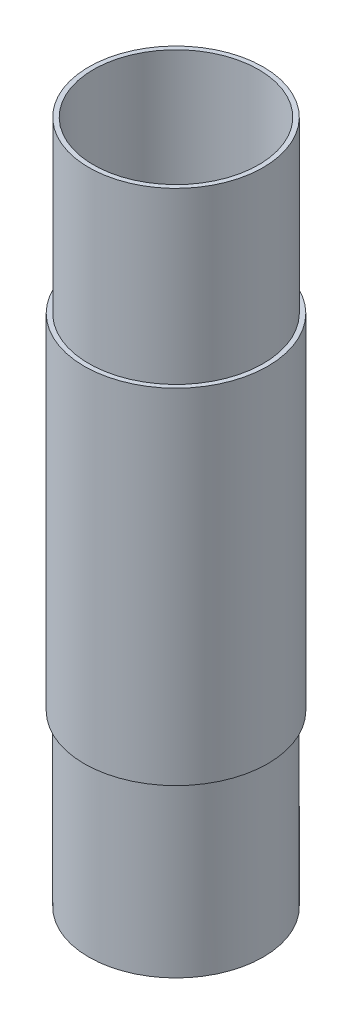
ISO-10303-21;
HEADER;
FILE_DESCRIPTION(('STEP AP214'),'2;1');
FILE_NAME('part.step','',(''),(''),'','','');
FILE_SCHEMA(('AUTOMOTIVE_DESIGN { 1 0 10303 214 1 1 1 1 }'));
ENDSEC;
DATA;
#1=APPLICATION_CONTEXT('core data for automotive mechanical design processes');
#2=APPLICATION_PROTOCOL_DEFINITION('international standard','automotive_design',2000,#1);
#3=PRODUCT_CONTEXT('',#1,'mechanical');
#4=PRODUCT('Part','Part','',(#3));
#5=PRODUCT_RELATED_PRODUCT_CATEGORY('part','',(#4));
#6=PRODUCT_DEFINITION_FORMATION('','',#4);
#7=PRODUCT_DEFINITION_CONTEXT('part definition',#1,'design');
#8=PRODUCT_DEFINITION('design','',#6,#7);
#9=PRODUCT_DEFINITION_SHAPE('','',#8);
#10=(LENGTH_UNIT() NAMED_UNIT(*) SI_UNIT(.MILLI.,.METRE.));
#11=(NAMED_UNIT(*) PLANE_ANGLE_UNIT() SI_UNIT($,.RADIAN.));
#12=(NAMED_UNIT(*) SI_UNIT($,.STERADIAN.) SOLID_ANGLE_UNIT());
#13=UNCERTAINTY_MEASURE_WITH_UNIT(LENGTH_MEASURE(1.E-05),#10,'distance_accuracy_value','');
#14=(GEOMETRIC_REPRESENTATION_CONTEXT(3) GLOBAL_UNCERTAINTY_ASSIGNED_CONTEXT((#13)) GLOBAL_UNIT_ASSIGNED_CONTEXT((#10,
#11,#12)) REPRESENTATION_CONTEXT('',''));
#15=CARTESIAN_POINT('',(0.,0.,0.));
#16=DIRECTION('',(0.,0.,1.));
#17=DIRECTION('',(1.,0.,0.));
#18=AXIS2_PLACEMENT_3D('',#15,#16,#17);
#19=CARTESIAN_POINT('',(0.,0.,0.));
#20=DIRECTION('',(0.,1.,0.));
#21=DIRECTION('',(0.,0.,1.));
#22=AXIS2_PLACEMENT_3D('',#19,#20,#21);
#23=PLANE('',#22);
#24=CARTESIAN_POINT('',(0.,0.,0.));
#25=DIRECTION('',(0.,1.,0.));
#26=DIRECTION('',(0.,0.,1.));
#27=AXIS2_PLACEMENT_3D('',#24,#25,#26);
#28=CIRCLE('',#27,40.);
#29=CARTESIAN_POINT('',(0.,0.,40.));
#30=VERTEX_POINT('',#29);
#31=EDGE_CURVE('E74',#30,#30,#28,.T.);
#32=ORIENTED_EDGE('',*,*,#31,.F.);
#33=EDGE_LOOP('',(#32));
#34=FACE_BOUND('',#33,.T.);
#35=CARTESIAN_POINT('',(0.,0.,0.));
#36=DIRECTION('',(0.,1.,0.));
#37=DIRECTION('',(0.,0.,1.));
#38=AXIS2_PLACEMENT_3D('',#35,#36,#37);
#39=CIRCLE('',#38,38.);
#40=CARTESIAN_POINT('',(0.,0.,38.));
#41=VERTEX_POINT('',#40);
#42=EDGE_CURVE('E11',#41,#41,#39,.F.);
#43=ORIENTED_EDGE('',*,*,#42,.F.);
#44=EDGE_LOOP('',(#43));
#45=FACE_BOUND('',#44,.T.);
#46=ADVANCED_FACE('F61',(#34,#45),#23,.F.);
#47=CARTESIAN_POINT('',(0.,150.,0.));
#48=DIRECTION('',(0.,1.,0.));
#49=DIRECTION('',(0.,0.,1.));
#50=AXIS2_PLACEMENT_3D('',#47,#48,#49);
#51=PLANE('',#50);
#52=CARTESIAN_POINT('',(0.,150.,0.));
#53=DIRECTION('',(0.,1.,0.));
#54=DIRECTION('',(0.,0.,1.));
#55=AXIS2_PLACEMENT_3D('',#52,#53,#54);
#56=CIRCLE('',#55,38.);
#57=CARTESIAN_POINT('',(0.,150.,-38.));
#58=VERTEX_POINT('',#57);
#59=EDGE_CURVE('E80',#58,#58,#56,.F.);
#60=ORIENTED_EDGE('',*,*,#59,.T.);
#61=EDGE_LOOP('',(#60));
#62=FACE_BOUND('',#61,.T.);
#63=CARTESIAN_POINT('',(0.,150.,0.));
#64=DIRECTION('',(0.,1.,0.));
#65=DIRECTION('',(0.,0.,1.));
#66=AXIS2_PLACEMENT_3D('',#63,#64,#65);
#67=CIRCLE('',#66,40.);
#68=CARTESIAN_POINT('',(0.,150.,40.));
#69=VERTEX_POINT('',#68);
#70=EDGE_CURVE('E69',#69,#69,#67,.T.);
#71=ORIENTED_EDGE('',*,*,#70,.T.);
#72=EDGE_LOOP('',(#71));
#73=FACE_BOUND('',#72,.T.);
#74=ADVANCED_FACE('F119',(#62,#73),#51,.T.);
#75=CARTESIAN_POINT('',(0.,150.,0.));
#76=DIRECTION('',(0.,-1.,0.));
#77=DIRECTION('',(0.,0.,-1.));
#78=AXIS2_PLACEMENT_3D('',#75,#76,#77);
#79=CYLINDRICAL_SURFACE('',#78,40.);
#80=ORIENTED_EDGE('',*,*,#70,.F.);
#81=EDGE_LOOP('',(#80));
#82=FACE_BOUND('',#81,.T.);
#83=ORIENTED_EDGE('',*,*,#31,.T.);
#84=EDGE_LOOP('',(#83));
#85=FACE_BOUND('',#84,.T.);
#86=ADVANCED_FACE('F63',(#82,#85),#79,.T.);
#87=CARTESIAN_POINT('',(0.,224.,0.));
#88=DIRECTION('',(0.,1.,0.));
#89=DIRECTION('',(0.,0.,1.));
#90=AXIS2_PLACEMENT_3D('',#87,#88,#89);
#91=PLANE('',#90);
#92=CARTESIAN_POINT('',(0.,224.,0.));
#93=DIRECTION('',(0.,1.,0.));
#94=DIRECTION('',(0.,0.,1.));
#95=AXIS2_PLACEMENT_3D('',#92,#93,#94);
#96=CIRCLE('',#95,38.);
#97=CARTESIAN_POINT('',(0.,224.,-38.));
#98=VERTEX_POINT('',#97);
#99=EDGE_CURVE('E85',#98,#98,#96,.T.);
#100=ORIENTED_EDGE('',*,*,#99,.T.);
#101=EDGE_LOOP('',(#100));
#102=FACE_BOUND('',#101,.T.);
#103=CARTESIAN_POINT('',(0.,224.,0.));
#104=DIRECTION('',(0.,1.,0.));
#105=DIRECTION('',(0.,0.,1.));
#106=AXIS2_PLACEMENT_3D('',#103,#104,#105);
#107=CIRCLE('',#106,36.);
#108=CARTESIAN_POINT('',(0.,224.,-36.));
#109=VERTEX_POINT('',#108);
#110=EDGE_CURVE('E89',#109,#109,#107,.T.);
#111=ORIENTED_EDGE('',*,*,#110,.F.);
#112=EDGE_LOOP('',(#111));
#113=FACE_BOUND('',#112,.T.);
#114=ADVANCED_FACE('F132',(#102,#113),#91,.T.);
#115=CARTESIAN_POINT('',(0.,224.,0.));
#116=DIRECTION('',(0.,-1.,0.));
#117=DIRECTION('',(0.,0.,-1.));
#118=AXIS2_PLACEMENT_3D('',#115,#116,#117);
#119=CYLINDRICAL_SURFACE('',#118,38.);
#120=CARTESIAN_POINT('',(0.,150.,-38.));
#121=CARTESIAN_POINT('',(0.,150.770833333333,-38.));
#122=CARTESIAN_POINT('',(0.,151.541666666667,-38.));
#123=CARTESIAN_POINT('',(0.,153.083333333333,-38.));
#124=CARTESIAN_POINT('',(0.,153.854166666667,-38.));
#125=CARTESIAN_POINT('',(0.,155.395833333333,-38.));
#126=CARTESIAN_POINT('',(0.,156.166666666667,-38.));
#127=CARTESIAN_POINT('',(0.,157.708333333333,-38.));
#128=CARTESIAN_POINT('',(0.,158.479166666667,-38.));
#129=CARTESIAN_POINT('',(0.,160.020833333333,-38.));
#130=CARTESIAN_POINT('',(0.,160.791666666667,-38.));
#131=CARTESIAN_POINT('',(0.,162.333333333333,-38.));
#132=CARTESIAN_POINT('',(0.,163.104166666667,-38.));
#133=CARTESIAN_POINT('',(0.,164.645833333333,-38.));
#134=CARTESIAN_POINT('',(0.,165.416666666667,-38.));
#135=CARTESIAN_POINT('',(0.,166.958333333333,-38.));
#136=CARTESIAN_POINT('',(0.,167.729166666667,-38.));
#137=CARTESIAN_POINT('',(0.,169.270833333333,-38.));
#138=CARTESIAN_POINT('',(0.,170.041666666667,-38.));
#139=CARTESIAN_POINT('',(0.,171.583333333333,-38.));
#140=CARTESIAN_POINT('',(0.,172.354166666667,-38.));
#141=CARTESIAN_POINT('',(0.,173.895833333333,-38.));
#142=CARTESIAN_POINT('',(0.,174.666666666667,-38.));
#143=CARTESIAN_POINT('',(0.,176.208333333333,-38.));
#144=CARTESIAN_POINT('',(0.,176.979166666667,-38.));
#145=CARTESIAN_POINT('',(0.,178.520833333333,-38.));
#146=CARTESIAN_POINT('',(0.,179.291666666667,-38.));
#147=CARTESIAN_POINT('',(0.,180.833333333333,-38.));
#148=CARTESIAN_POINT('',(0.,181.604166666667,-38.));
#149=CARTESIAN_POINT('',(0.,183.145833333333,-38.));
#150=CARTESIAN_POINT('',(0.,183.916666666667,-38.));
#151=CARTESIAN_POINT('',(0.,185.458333333333,-38.));
#152=CARTESIAN_POINT('',(0.,186.229166666667,-38.));
#153=CARTESIAN_POINT('',(0.,187.770833333333,-38.));
#154=CARTESIAN_POINT('',(0.,188.541666666667,-38.));
#155=CARTESIAN_POINT('',(0.,190.083333333333,-38.));
#156=CARTESIAN_POINT('',(0.,190.854166666667,-38.));
#157=CARTESIAN_POINT('',(0.,192.395833333333,-38.));
#158=CARTESIAN_POINT('',(0.,193.166666666667,-38.));
#159=CARTESIAN_POINT('',(0.,194.708333333333,-38.));
#160=CARTESIAN_POINT('',(0.,195.479166666667,-38.));
#161=CARTESIAN_POINT('',(0.,197.020833333333,-38.));
#162=CARTESIAN_POINT('',(0.,197.791666666667,-38.));
#163=CARTESIAN_POINT('',(0.,199.333333333333,-38.));
#164=CARTESIAN_POINT('',(0.,200.104166666667,-38.));
#165=CARTESIAN_POINT('',(0.,201.645833333333,-38.));
#166=CARTESIAN_POINT('',(0.,202.416666666667,-38.));
#167=CARTESIAN_POINT('',(0.,203.958333333333,-38.));
#168=CARTESIAN_POINT('',(0.,204.729166666667,-38.));
#169=CARTESIAN_POINT('',(0.,206.270833333333,-38.));
#170=CARTESIAN_POINT('',(0.,207.041666666667,-38.));
#171=CARTESIAN_POINT('',(0.,208.583333333333,-38.));
#172=CARTESIAN_POINT('',(0.,209.354166666667,-38.));
#173=CARTESIAN_POINT('',(0.,210.895833333333,-38.));
#174=CARTESIAN_POINT('',(0.,211.666666666667,-38.));
#175=CARTESIAN_POINT('',(0.,213.208333333333,-38.));
#176=CARTESIAN_POINT('',(0.,213.979166666667,-38.));
#177=CARTESIAN_POINT('',(0.,215.520833333333,-38.));
#178=CARTESIAN_POINT('',(0.,216.291666666667,-38.));
#179=CARTESIAN_POINT('',(0.,217.833333333333,-38.));
#180=CARTESIAN_POINT('',(0.,218.604166666667,-38.));
#181=CARTESIAN_POINT('',(0.,220.145833333333,-38.));
#182=CARTESIAN_POINT('',(0.,220.916666666667,-38.));
#183=CARTESIAN_POINT('',(0.,222.458333333333,-38.));
#184=CARTESIAN_POINT('',(0.,223.229166666667,-38.));
#185=CARTESIAN_POINT('',(0.,224.,-38.));
#186=B_SPLINE_CURVE_WITH_KNOTS('',3,(#120,#121,#122,#123,#124,#125,#126,#127,#128,#129,#130,
#131,#132,#133,#134,#135,#136,#137,#138,#139,#140,#141,#142,#143,#144,#145,#146,#147,#148,#149,
#150,#151,#152,#153,#154,#155,#156,#157,#158,#159,#160,#161,#162,#163,#164,#165,#166,#167,#168,
#169,#170,#171,#172,#173,#174,#175,#176,#177,#178,#179,#180,#181,#182,#183,#184,#185),
.UNSPECIFIED.,.F.,.F.,(4,2,2,2,2,2,2,2,2,2,2,2,2,2,2,2,2,2,2,2,2,2,2,2,2,2,2,2,2,2,2,2,4),(0.,
2.3125,4.62500000000002,6.93750000000001,9.25000000000001,11.5625,13.875,16.1875,18.5,20.8125,
23.125,25.4375,27.75,30.0625,32.375,34.6875,37.,39.3125,41.625,43.9375,46.25,48.5625,50.875,
53.1875,55.5,57.8125,60.125,62.4375,64.75,67.0625,69.375,71.6875,74.),.UNSPECIFIED.);
#187=EDGE_CURVE('BSEAM115',#58,#98,#186,.T.);
#188=ORIENTED_EDGE('',*,*,#59,.F.);
#189=ORIENTED_EDGE('',*,*,#99,.F.);
#190=ORIENTED_EDGE('',*,*,#187,.T.);
#191=ORIENTED_EDGE('',*,*,#187,.F.);
#192=EDGE_LOOP('',(#188,#190,#189,#191));
#193=FACE_BOUND('',#192,.T.);
#194=ADVANCED_FACE('F115',(#193),#119,.T.);
#195=CARTESIAN_POINT('',(0.,224.,0.));
#196=DIRECTION('',(0.,-1.,0.));
#197=DIRECTION('',(0.,0.,-1.));
#198=AXIS2_PLACEMENT_3D('',#195,#196,#197);
#199=CYLINDRICAL_SURFACE('',#198,36.);
#200=CARTESIAN_POINT('',(0.,-74.,0.));
#201=DIRECTION('',(0.,-1.,0.));
#202=DIRECTION('',(1.,0.,0.));
#203=AXIS2_PLACEMENT_3D('',#200,#201,#202);
#204=CIRCLE('',#203,36.);
#205=CARTESIAN_POINT('',(0.,-74.,-36.));
#206=VERTEX_POINT('',#205);
#207=EDGE_CURVE('E97',#206,#206,#204,.T.);
#208=CARTESIAN_POINT('',(0.,224.,-36.));
#209=CARTESIAN_POINT('',(0.,220.895833333333,-36.));
#210=CARTESIAN_POINT('',(0.,217.791666666667,-36.));
#211=CARTESIAN_POINT('',(0.,211.583333333333,-36.));
#212=CARTESIAN_POINT('',(0.,208.479166666667,-36.));
#213=CARTESIAN_POINT('',(0.,202.270833333333,-36.));
#214=CARTESIAN_POINT('',(0.,199.166666666667,-36.));
#215=CARTESIAN_POINT('',(0.,192.958333333333,-36.));
#216=CARTESIAN_POINT('',(0.,189.854166666667,-36.));
#217=CARTESIAN_POINT('',(0.,183.645833333333,-36.));
#218=CARTESIAN_POINT('',(0.,180.541666666667,-36.));
#219=CARTESIAN_POINT('',(0.,174.333333333333,-36.));
#220=CARTESIAN_POINT('',(0.,171.229166666667,-36.));
#221=CARTESIAN_POINT('',(0.,165.020833333333,-36.));
#222=CARTESIAN_POINT('',(0.,161.916666666667,-36.));
#223=CARTESIAN_POINT('',(0.,155.708333333333,-36.));
#224=CARTESIAN_POINT('',(0.,152.604166666667,-36.));
#225=CARTESIAN_POINT('',(0.,146.395833333333,-36.));
#226=CARTESIAN_POINT('',(0.,143.291666666667,-36.));
#227=CARTESIAN_POINT('',(0.,137.083333333333,-36.));
#228=CARTESIAN_POINT('',(0.,133.979166666667,-36.));
#229=CARTESIAN_POINT('',(0.,127.770833333333,-36.));
#230=CARTESIAN_POINT('',(0.,124.666666666667,-36.));
#231=CARTESIAN_POINT('',(0.,118.458333333333,-36.));
#232=CARTESIAN_POINT('',(0.,115.354166666667,-36.));
#233=CARTESIAN_POINT('',(0.,109.145833333333,-36.));
#234=CARTESIAN_POINT('',(0.,106.041666666667,-36.));
#235=CARTESIAN_POINT('',(0.,99.8333333333333,-36.));
#236=CARTESIAN_POINT('',(0.,96.7291666666666,-36.));
#237=CARTESIAN_POINT('',(0.,90.5208333333333,-36.));
#238=CARTESIAN_POINT('',(0.,87.4166666666666,-36.));
#239=CARTESIAN_POINT('',(0.,81.2083333333333,-36.));
#240=CARTESIAN_POINT('',(0.,78.1041666666666,-36.));
#241=CARTESIAN_POINT('',(0.,71.8958333333333,-36.));
#242=CARTESIAN_POINT('',(0.,68.7916666666666,-36.));
#243=CARTESIAN_POINT('',(0.,62.5833333333333,-36.));
#244=CARTESIAN_POINT('',(0.,59.4791666666666,-36.));
#245=CARTESIAN_POINT('',(0.,53.2708333333333,-36.));
#246=CARTESIAN_POINT('',(0.,50.1666666666666,-36.));
#247=CARTESIAN_POINT('',(0.,43.9583333333333,-36.));
#248=CARTESIAN_POINT('',(0.,40.8541666666666,-36.));
#249=CARTESIAN_POINT('',(0.,34.6458333333333,-36.));
#250=CARTESIAN_POINT('',(0.,31.5416666666666,-36.));
#251=CARTESIAN_POINT('',(0.,25.3333333333333,-36.));
#252=CARTESIAN_POINT('',(0.,22.2291666666666,-36.));
#253=CARTESIAN_POINT('',(0.,16.0208333333333,-36.));
#254=CARTESIAN_POINT('',(0.,12.9166666666666,-36.));
#255=CARTESIAN_POINT('',(0.,6.70833333333328,-36.));
#256=CARTESIAN_POINT('',(0.,3.60416666666661,-36.));
#257=CARTESIAN_POINT('',(0.,-2.60416666666672,-36.));
#258=CARTESIAN_POINT('',(0.,-5.70833333333339,-36.));
#259=CARTESIAN_POINT('',(0.,-11.9166666666667,-36.));
#260=CARTESIAN_POINT('',(0.,-15.0208333333334,-36.));
#261=CARTESIAN_POINT('',(0.,-21.2291666666667,-36.));
#262=CARTESIAN_POINT('',(0.,-24.3333333333334,-36.));
#263=CARTESIAN_POINT('',(0.,-30.5416666666667,-36.));
#264=CARTESIAN_POINT('',(0.,-33.6458333333333,-36.));
#265=CARTESIAN_POINT('',(0.,-39.8541666666667,-36.));
#266=CARTESIAN_POINT('',(0.,-42.9583333333333,-36.));
#267=CARTESIAN_POINT('',(0.,-49.1666666666667,-36.));
#268=CARTESIAN_POINT('',(0.,-52.2708333333333,-36.));
#269=CARTESIAN_POINT('',(0.,-58.4791666666667,-36.));
#270=CARTESIAN_POINT('',(0.,-61.5833333333333,-36.));
#271=CARTESIAN_POINT('',(0.,-67.7916666666667,-36.));
#272=CARTESIAN_POINT('',(0.,-70.8958333333333,-36.));
#273=CARTESIAN_POINT('',(0.,-74.,-36.));
#274=B_SPLINE_CURVE_WITH_KNOTS('',3,(#208,#209,#210,#211,#212,#213,#214,#215,#216,#217,#218,
#219,#220,#221,#222,#223,#224,#225,#226,#227,#228,#229,#230,#231,#232,#233,#234,#235,#236,#237,
#238,#239,#240,#241,#242,#243,#244,#245,#246,#247,#248,#249,#250,#251,#252,#253,#254,#255,#256,
#257,#258,#259,#260,#261,#262,#263,#264,#265,#266,#267,#268,#269,#270,#271,#272,#273),
.UNSPECIFIED.,.F.,.F.,(4,2,2,2,2,2,2,2,2,2,2,2,2,2,2,2,2,2,2,2,2,2,2,2,2,2,2,2,2,2,2,2,4),(0.,
9.31249999999997,18.625,27.9375,37.25,46.5625,55.875,65.1875,74.5,83.8125,93.125,102.4375,
111.75,121.0625,130.375,139.6875,149.,158.3125,167.625,176.9375,186.25,195.5625,204.875,
214.1875,223.5,232.8125,242.125,251.4375,260.75,270.0625,279.375,288.6875,298.),.UNSPECIFIED.);
#275=EDGE_CURVE('BSEAM102',#109,#206,#274,.T.);
#276=ORIENTED_EDGE('',*,*,#110,.T.);
#277=ORIENTED_EDGE('',*,*,#207,.T.);
#278=ORIENTED_EDGE('',*,*,#275,.T.);
#279=ORIENTED_EDGE('',*,*,#275,.F.);
#280=EDGE_LOOP('',(#276,#278,#277,#279));
#281=FACE_BOUND('',#280,.T.);
#282=ADVANCED_FACE('F102',(#281),#199,.F.);
#283=CARTESIAN_POINT('',(0.,-74.,0.));
#284=DIRECTION('',(0.,-1.,0.));
#285=DIRECTION('',(0.,0.,-1.));
#286=AXIS2_PLACEMENT_3D('',#283,#284,#285);
#287=PLANE('',#286);
#288=CARTESIAN_POINT('',(0.,-74.,0.));
#289=DIRECTION('',(0.,-1.,0.));
#290=DIRECTION('',(1.,0.,0.));
#291=AXIS2_PLACEMENT_3D('',#288,#289,#290);
#292=CIRCLE('',#291,38.);
#293=CARTESIAN_POINT('',(38.,-74.,0.));
#294=VERTEX_POINT('',#293);
#295=EDGE_CURVE('E93',#294,#294,#292,.T.);
#296=ORIENTED_EDGE('',*,*,#295,.T.);
#297=EDGE_LOOP('',(#296));
#298=FACE_BOUND('',#297,.T.);
#299=ORIENTED_EDGE('',*,*,#207,.F.);
#300=EDGE_LOOP('',(#299));
#301=FACE_BOUND('',#300,.T.);
#302=ADVANCED_FACE('F104',(#298,#301),#287,.T.);
#303=CARTESIAN_POINT('',(0.,-74.,0.));
#304=DIRECTION('',(0.,1.,0.));
#305=DIRECTION('',(0.,0.,1.));
#306=AXIS2_PLACEMENT_3D('',#303,#304,#305);
#307=CYLINDRICAL_SURFACE('',#306,38.);
#308=ORIENTED_EDGE('',*,*,#295,.F.);
#309=EDGE_LOOP('',(#308));
#310=FACE_BOUND('',#309,.T.);
#311=ORIENTED_EDGE('',*,*,#42,.T.);
#312=EDGE_LOOP('',(#311));
#313=FACE_BOUND('',#312,.T.);
#314=ADVANCED_FACE('F106',(#310,#313),#307,.T.);
#315=CLOSED_SHELL('',(#46,#74,#86,#114,#194,#282,#302,#314));
#316=MANIFOLD_SOLID_BREP('B2',#315);
#317=ADVANCED_BREP_SHAPE_REPRESENTATION('',(#18,#316),#14);
#318=SHAPE_DEFINITION_REPRESENTATION(#9,#317);
ENDSEC;
END-ISO-10303-21;
